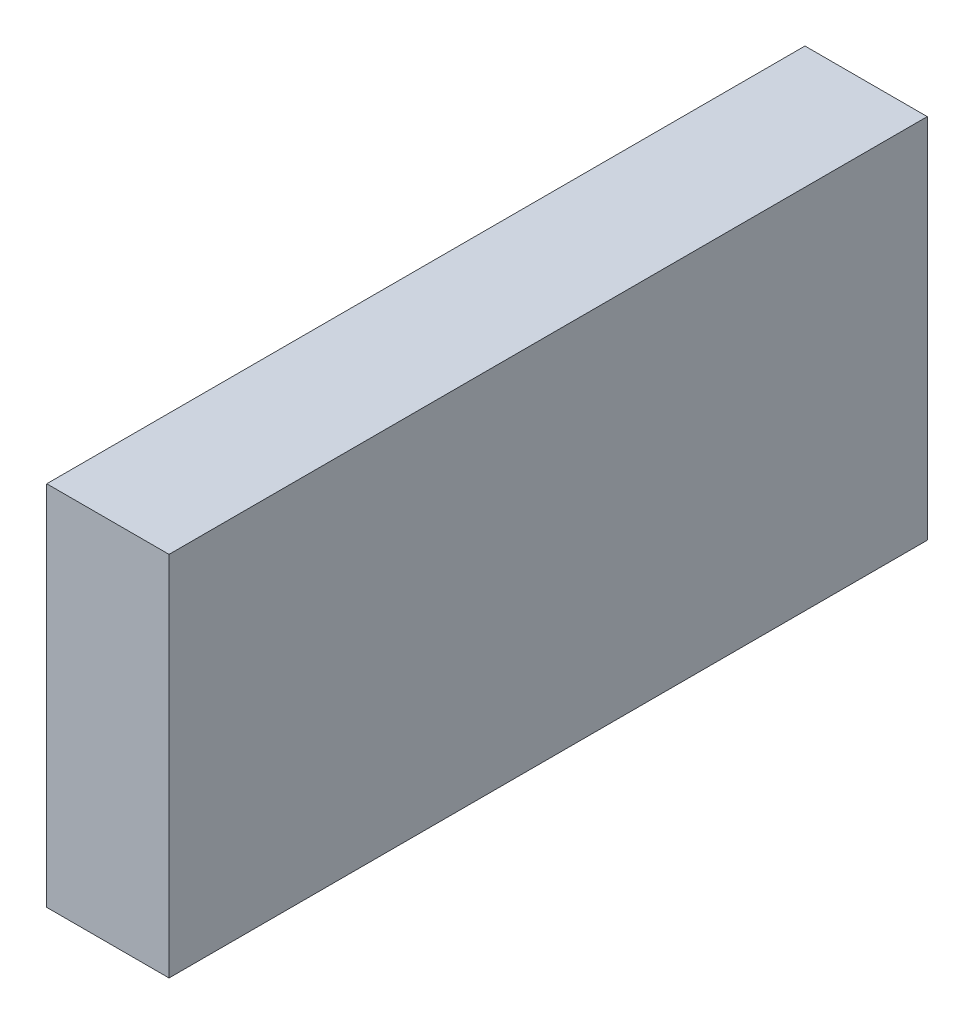
ISO-10303-21;
HEADER;
FILE_DESCRIPTION(('STEP AP214'),'2;1');
FILE_NAME('part.step','',(''),(''),'','','');
FILE_SCHEMA(('AUTOMOTIVE_DESIGN { 1 0 10303 214 1 1 1 1 }'));
ENDSEC;
DATA;
#1=APPLICATION_CONTEXT('core data for automotive mechanical design processes');
#2=APPLICATION_PROTOCOL_DEFINITION('international standard','automotive_design',2000,#1);
#3=PRODUCT_CONTEXT('',#1,'mechanical');
#4=PRODUCT('Part','Part','',(#3));
#5=PRODUCT_RELATED_PRODUCT_CATEGORY('part','',(#4));
#6=PRODUCT_DEFINITION_FORMATION('','',#4);
#7=PRODUCT_DEFINITION_CONTEXT('part definition',#1,'design');
#8=PRODUCT_DEFINITION('design','',#6,#7);
#9=PRODUCT_DEFINITION_SHAPE('','',#8);
#10=(LENGTH_UNIT() NAMED_UNIT(*) SI_UNIT(.MILLI.,.METRE.));
#11=(NAMED_UNIT(*) PLANE_ANGLE_UNIT() SI_UNIT($,.RADIAN.));
#12=(NAMED_UNIT(*) SI_UNIT($,.STERADIAN.) SOLID_ANGLE_UNIT());
#13=UNCERTAINTY_MEASURE_WITH_UNIT(LENGTH_MEASURE(1.E-05),#10,'distance_accuracy_value','');
#14=(GEOMETRIC_REPRESENTATION_CONTEXT(3) GLOBAL_UNCERTAINTY_ASSIGNED_CONTEXT((#13)) GLOBAL_UNIT_ASSIGNED_CONTEXT((#10,
#11,#12)) REPRESENTATION_CONTEXT('',''));
#15=CARTESIAN_POINT('',(0.,0.,0.));
#16=DIRECTION('',(0.,0.,1.));
#17=DIRECTION('',(1.,0.,0.));
#18=AXIS2_PLACEMENT_3D('',#15,#16,#17);
#19=CARTESIAN_POINT('',(10.,-30.,62.));
#20=DIRECTION('',(-1.,0.,0.));
#21=DIRECTION('',(0.,0.,1.));
#22=AXIS2_PLACEMENT_3D('',#19,#20,#21);
#23=PLANE('',#22);
#24=DIRECTION('',(0.,1.,0.));
#25=VECTOR('',#24,1.);
#26=CARTESIAN_POINT('',(10.,-30.,-62.));
#27=LINE('',#26,#25);
#28=CARTESIAN_POINT('',(10.,-30.,-62.));
#29=VERTEX_POINT('',#28);
#30=CARTESIAN_POINT('',(10.,30.,-62.));
#31=VERTEX_POINT('',#30);
#32=EDGE_CURVE('E107',#29,#31,#27,.T.);
#33=ORIENTED_EDGE('',*,*,#32,.T.);
#34=DIRECTION('',(0.,0.,-1.));
#35=VECTOR('',#34,1.);
#36=CARTESIAN_POINT('',(10.,30.,62.));
#37=LINE('',#36,#35);
#38=CARTESIAN_POINT('',(10.,30.,62.));
#39=VERTEX_POINT('',#38);
#40=EDGE_CURVE('E11',#39,#31,#37,.T.);
#41=ORIENTED_EDGE('',*,*,#40,.F.);
#42=DIRECTION('',(0.,1.,0.));
#43=VECTOR('',#42,1.);
#44=CARTESIAN_POINT('',(10.,-30.,62.));
#45=LINE('',#44,#43);
#46=CARTESIAN_POINT('',(10.,-30.,62.));
#47=VERTEX_POINT('',#46);
#48=EDGE_CURVE('E91',#47,#39,#45,.T.);
#49=ORIENTED_EDGE('',*,*,#48,.F.);
#50=DIRECTION('',(0.,0.,-1.));
#51=VECTOR('',#50,1.);
#52=CARTESIAN_POINT('',(10.,-30.,62.));
#53=LINE('',#52,#51);
#54=EDGE_CURVE('E103',#47,#29,#53,.T.);
#55=ORIENTED_EDGE('',*,*,#54,.T.);
#56=EDGE_LOOP('',(#33,#41,#49,#55));
#57=FACE_BOUND('',#56,.T.);
#58=ADVANCED_FACE('F39',(#57),#23,.F.);
#59=CARTESIAN_POINT('',(-10.,30.,62.));
#60=DIRECTION('',(0.,-1.,0.));
#61=DIRECTION('',(0.,0.,-1.));
#62=AXIS2_PLACEMENT_3D('',#59,#60,#61);
#63=PLANE('',#62);
#64=DIRECTION('',(-1.,0.,0.));
#65=VECTOR('',#64,1.);
#66=CARTESIAN_POINT('',(-10.,30.,-62.));
#67=LINE('',#66,#65);
#68=CARTESIAN_POINT('',(-10.,30.,-62.));
#69=VERTEX_POINT('',#68);
#70=EDGE_CURVE('E96',#31,#69,#67,.T.);
#71=ORIENTED_EDGE('',*,*,#70,.T.);
#72=DIRECTION('',(0.,0.,-1.));
#73=VECTOR('',#72,1.);
#74=CARTESIAN_POINT('',(-10.,30.,62.));
#75=LINE('',#74,#73);
#76=CARTESIAN_POINT('',(-10.,30.,62.));
#77=VERTEX_POINT('',#76);
#78=EDGE_CURVE('E48',#77,#69,#75,.T.);
#79=ORIENTED_EDGE('',*,*,#78,.F.);
#80=DIRECTION('',(-1.,0.,0.));
#81=VECTOR('',#80,1.);
#82=CARTESIAN_POINT('',(-10.,30.,62.));
#83=LINE('',#82,#81);
#84=EDGE_CURVE('E86',#39,#77,#83,.T.);
#85=ORIENTED_EDGE('',*,*,#84,.F.);
#86=ORIENTED_EDGE('',*,*,#40,.T.);
#87=EDGE_LOOP('',(#71,#79,#85,#86));
#88=FACE_BOUND('',#87,.T.);
#89=ADVANCED_FACE('F95',(#88),#63,.F.);
#90=CARTESIAN_POINT('',(-10.,-30.,62.));
#91=DIRECTION('',(1.,0.,0.));
#92=DIRECTION('',(0.,0.,-1.));
#93=AXIS2_PLACEMENT_3D('',#90,#91,#92);
#94=PLANE('',#93);
#95=DIRECTION('',(0.,-1.,0.));
#96=VECTOR('',#95,1.);
#97=CARTESIAN_POINT('',(-10.,-30.,-62.));
#98=LINE('',#97,#96);
#99=CARTESIAN_POINT('',(-10.,-30.,-62.));
#100=VERTEX_POINT('',#99);
#101=EDGE_CURVE('E73',#69,#100,#98,.T.);
#102=ORIENTED_EDGE('',*,*,#101,.T.);
#103=DIRECTION('',(0.,0.,-1.));
#104=VECTOR('',#103,1.);
#105=CARTESIAN_POINT('',(-10.,-30.,62.));
#106=LINE('',#105,#104);
#107=CARTESIAN_POINT('',(-10.,-30.,62.));
#108=VERTEX_POINT('',#107);
#109=EDGE_CURVE('E98',#108,#100,#106,.T.);
#110=ORIENTED_EDGE('',*,*,#109,.F.);
#111=DIRECTION('',(0.,-1.,0.));
#112=VECTOR('',#111,1.);
#113=CARTESIAN_POINT('',(-10.,-30.,62.));
#114=LINE('',#113,#112);
#115=EDGE_CURVE('E89',#77,#108,#114,.T.);
#116=ORIENTED_EDGE('',*,*,#115,.F.);
#117=ORIENTED_EDGE('',*,*,#78,.T.);
#118=EDGE_LOOP('',(#102,#110,#116,#117));
#119=FACE_BOUND('',#118,.T.);
#120=ADVANCED_FACE('F99',(#119),#94,.F.);
#121=CARTESIAN_POINT('',(-10.,-30.,62.));
#122=DIRECTION('',(0.,1.,0.));
#123=DIRECTION('',(0.,0.,1.));
#124=AXIS2_PLACEMENT_3D('',#121,#122,#123);
#125=PLANE('',#124);
#126=DIRECTION('',(1.,0.,0.));
#127=VECTOR('',#126,1.);
#128=CARTESIAN_POINT('',(-10.,-30.,-62.));
#129=LINE('',#128,#127);
#130=EDGE_CURVE('E79',#100,#29,#129,.T.);
#131=ORIENTED_EDGE('',*,*,#130,.T.);
#132=ORIENTED_EDGE('',*,*,#54,.F.);
#133=DIRECTION('',(1.,0.,0.));
#134=VECTOR('',#133,1.);
#135=CARTESIAN_POINT('',(-10.,-30.,62.));
#136=LINE('',#135,#134);
#137=EDGE_CURVE('E56',#108,#47,#136,.T.);
#138=ORIENTED_EDGE('',*,*,#137,.F.);
#139=ORIENTED_EDGE('',*,*,#109,.T.);
#140=EDGE_LOOP('',(#131,#132,#138,#139));
#141=FACE_BOUND('',#140,.T.);
#142=ADVANCED_FACE('F120',(#141),#125,.F.);
#143=CARTESIAN_POINT('',(0.,0.,62.));
#144=DIRECTION('',(0.,0.,-1.));
#145=DIRECTION('',(-1.,0.,0.));
#146=AXIS2_PLACEMENT_3D('',#143,#144,#145);
#147=PLANE('',#146);
#148=ORIENTED_EDGE('',*,*,#48,.T.);
#149=ORIENTED_EDGE('',*,*,#84,.T.);
#150=ORIENTED_EDGE('',*,*,#115,.T.);
#151=ORIENTED_EDGE('',*,*,#137,.T.);
#152=EDGE_LOOP('',(#148,#149,#150,#151));
#153=FACE_BOUND('',#152,.T.);
#154=ADVANCED_FACE('F87',(#153),#147,.F.);
#155=CARTESIAN_POINT('',(0.,0.,-62.));
#156=DIRECTION('',(0.,0.,-1.));
#157=DIRECTION('',(-1.,0.,0.));
#158=AXIS2_PLACEMENT_3D('',#155,#156,#157);
#159=PLANE('',#158);
#160=ORIENTED_EDGE('',*,*,#32,.F.);
#161=ORIENTED_EDGE('',*,*,#130,.F.);
#162=ORIENTED_EDGE('',*,*,#101,.F.);
#163=ORIENTED_EDGE('',*,*,#70,.F.);
#164=EDGE_LOOP('',(#160,#161,#162,#163));
#165=FACE_BOUND('',#164,.T.);
#166=ADVANCED_FACE('F123',(#165),#159,.T.);
#167=CLOSED_SHELL('',(#58,#89,#120,#142,#154,#166));
#168=MANIFOLD_SOLID_BREP('B2',#167);
#169=ADVANCED_BREP_SHAPE_REPRESENTATION('',(#18,#168),#14);
#170=SHAPE_DEFINITION_REPRESENTATION(#9,#169);
ENDSEC;
END-ISO-10303-21;
